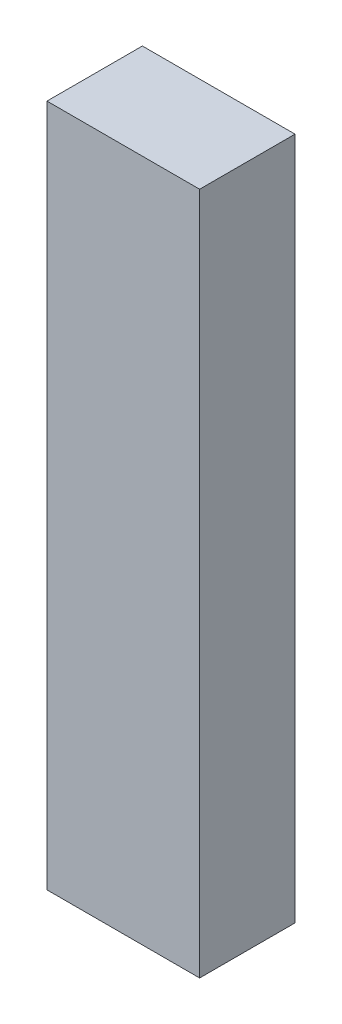
ISO-10303-21;
HEADER;
FILE_DESCRIPTION(('STEP AP214'),'2;1');
FILE_NAME('part.step','',(''),(''),'','','');
FILE_SCHEMA(('AUTOMOTIVE_DESIGN { 1 0 10303 214 1 1 1 1 }'));
ENDSEC;
DATA;
#1=APPLICATION_CONTEXT('core data for automotive mechanical design processes');
#2=APPLICATION_PROTOCOL_DEFINITION('international standard','automotive_design',2000,#1);
#3=PRODUCT_CONTEXT('',#1,'mechanical');
#4=PRODUCT('Part','Part','',(#3));
#5=PRODUCT_RELATED_PRODUCT_CATEGORY('part','',(#4));
#6=PRODUCT_DEFINITION_FORMATION('','',#4);
#7=PRODUCT_DEFINITION_CONTEXT('part definition',#1,'design');
#8=PRODUCT_DEFINITION('design','',#6,#7);
#9=PRODUCT_DEFINITION_SHAPE('','',#8);
#10=(LENGTH_UNIT() NAMED_UNIT(*) SI_UNIT(.MILLI.,.METRE.));
#11=(NAMED_UNIT(*) PLANE_ANGLE_UNIT() SI_UNIT($,.RADIAN.));
#12=(NAMED_UNIT(*) SI_UNIT($,.STERADIAN.) SOLID_ANGLE_UNIT());
#13=UNCERTAINTY_MEASURE_WITH_UNIT(LENGTH_MEASURE(1.E-05),#10,'distance_accuracy_value','');
#14=(GEOMETRIC_REPRESENTATION_CONTEXT(3) GLOBAL_UNCERTAINTY_ASSIGNED_CONTEXT((#13)) GLOBAL_UNIT_ASSIGNED_CONTEXT((#10,
#11,#12)) REPRESENTATION_CONTEXT('',''));
#15=CARTESIAN_POINT('',(0.,0.,0.));
#16=DIRECTION('',(0.,0.,1.));
#17=DIRECTION('',(1.,0.,0.));
#18=AXIS2_PLACEMENT_3D('',#15,#16,#17);
#19=CARTESIAN_POINT('',(1298.,1469.,-800.));
#20=DIRECTION('',(-1.,0.,0.));
#21=DIRECTION('',(0.,0.,1.));
#22=AXIS2_PLACEMENT_3D('',#19,#20,#21);
#23=PLANE('',#22);
#24=DIRECTION('',(0.,-1.,0.));
#25=VECTOR('',#24,1.);
#26=CARTESIAN_POINT('',(1298.,1469.,-775.));
#27=LINE('',#26,#25);
#28=CARTESIAN_POINT('',(1298.,1648.,-775.));
#29=VERTEX_POINT('',#28);
#30=CARTESIAN_POINT('',(1298.,1469.,-775.));
#31=VERTEX_POINT('',#30);
#32=EDGE_CURVE('E103',#29,#31,#27,.T.);
#33=ORIENTED_EDGE('',*,*,#32,.F.);
#34=DIRECTION('',(0.,0.,1.));
#35=VECTOR('',#34,1.);
#36=CARTESIAN_POINT('',(1298.,1648.,-800.));
#37=LINE('',#36,#35);
#38=CARTESIAN_POINT('',(1298.,1648.,-800.));
#39=VERTEX_POINT('',#38);
#40=EDGE_CURVE('E11',#39,#29,#37,.T.);
#41=ORIENTED_EDGE('',*,*,#40,.F.);
#42=DIRECTION('',(0.,-1.,0.));
#43=VECTOR('',#42,1.);
#44=CARTESIAN_POINT('',(1298.,1469.,-800.));
#45=LINE('',#44,#43);
#46=CARTESIAN_POINT('',(1298.,1469.,-800.));
#47=VERTEX_POINT('',#46);
#48=EDGE_CURVE('E97',#39,#47,#45,.T.);
#49=ORIENTED_EDGE('',*,*,#48,.T.);
#50=DIRECTION('',(0.,0.,1.));
#51=VECTOR('',#50,1.);
#52=CARTESIAN_POINT('',(1298.,1469.,-800.));
#53=LINE('',#52,#51);
#54=EDGE_CURVE('E42',#47,#31,#53,.T.);
#55=ORIENTED_EDGE('',*,*,#54,.T.);
#56=EDGE_LOOP('',(#33,#41,#49,#55));
#57=FACE_BOUND('',#56,.T.);
#58=ADVANCED_FACE('F39',(#57),#23,.T.);
#59=CARTESIAN_POINT('',(1298.,1648.,-800.));
#60=DIRECTION('',(0.,1.,0.));
#61=DIRECTION('',(0.,0.,1.));
#62=AXIS2_PLACEMENT_3D('',#59,#60,#61);
#63=PLANE('',#62);
#64=DIRECTION('',(-1.,0.,0.));
#65=VECTOR('',#64,1.);
#66=CARTESIAN_POINT('',(1298.,1648.,-775.));
#67=LINE('',#66,#65);
#68=CARTESIAN_POINT('',(1338.,1648.,-775.));
#69=VERTEX_POINT('',#68);
#70=EDGE_CURVE('E99',#69,#29,#67,.T.);
#71=ORIENTED_EDGE('',*,*,#70,.F.);
#72=DIRECTION('',(0.,0.,1.));
#73=VECTOR('',#72,1.);
#74=CARTESIAN_POINT('',(1338.,1648.,-800.));
#75=LINE('',#74,#73);
#76=CARTESIAN_POINT('',(1338.,1648.,-800.));
#77=VERTEX_POINT('',#76);
#78=EDGE_CURVE('E48',#77,#69,#75,.T.);
#79=ORIENTED_EDGE('',*,*,#78,.F.);
#80=DIRECTION('',(-1.,0.,0.));
#81=VECTOR('',#80,1.);
#82=CARTESIAN_POINT('',(1298.,1648.,-800.));
#83=LINE('',#82,#81);
#84=EDGE_CURVE('E94',#77,#39,#83,.T.);
#85=ORIENTED_EDGE('',*,*,#84,.T.);
#86=ORIENTED_EDGE('',*,*,#40,.T.);
#87=EDGE_LOOP('',(#71,#79,#85,#86));
#88=FACE_BOUND('',#87,.T.);
#89=ADVANCED_FACE('F113',(#88),#63,.T.);
#90=CARTESIAN_POINT('',(1338.,1469.,-800.));
#91=DIRECTION('',(1.,0.,0.));
#92=DIRECTION('',(0.,0.,-1.));
#93=AXIS2_PLACEMENT_3D('',#90,#91,#92);
#94=PLANE('',#93);
#95=DIRECTION('',(0.,1.,0.));
#96=VECTOR('',#95,1.);
#97=CARTESIAN_POINT('',(1338.,1469.,-775.));
#98=LINE('',#97,#96);
#99=CARTESIAN_POINT('',(1338.,1469.,-775.));
#100=VERTEX_POINT('',#99);
#101=EDGE_CURVE('E89',#100,#69,#98,.T.);
#102=ORIENTED_EDGE('',*,*,#101,.F.);
#103=DIRECTION('',(0.,0.,1.));
#104=VECTOR('',#103,1.);
#105=CARTESIAN_POINT('',(1338.,1469.,-800.));
#106=LINE('',#105,#104);
#107=CARTESIAN_POINT('',(1338.,1469.,-800.));
#108=VERTEX_POINT('',#107);
#109=EDGE_CURVE('E84',#108,#100,#106,.T.);
#110=ORIENTED_EDGE('',*,*,#109,.F.);
#111=DIRECTION('',(0.,1.,0.));
#112=VECTOR('',#111,1.);
#113=CARTESIAN_POINT('',(1338.,1469.,-800.));
#114=LINE('',#113,#112);
#115=EDGE_CURVE('E87',#108,#77,#114,.T.);
#116=ORIENTED_EDGE('',*,*,#115,.T.);
#117=ORIENTED_EDGE('',*,*,#78,.T.);
#118=EDGE_LOOP('',(#102,#110,#116,#117));
#119=FACE_BOUND('',#118,.T.);
#120=ADVANCED_FACE('F86',(#119),#94,.T.);
#121=CARTESIAN_POINT('',(1298.,1469.,-800.));
#122=DIRECTION('',(0.,-1.,0.));
#123=DIRECTION('',(0.,0.,-1.));
#124=AXIS2_PLACEMENT_3D('',#121,#122,#123);
#125=PLANE('',#124);
#126=DIRECTION('',(1.,0.,0.));
#127=VECTOR('',#126,1.);
#128=CARTESIAN_POINT('',(1298.,1469.,-775.));
#129=LINE('',#128,#127);
#130=EDGE_CURVE('E106',#31,#100,#129,.T.);
#131=ORIENTED_EDGE('',*,*,#130,.F.);
#132=ORIENTED_EDGE('',*,*,#54,.F.);
#133=DIRECTION('',(1.,0.,0.));
#134=VECTOR('',#133,1.);
#135=CARTESIAN_POINT('',(1298.,1469.,-800.));
#136=LINE('',#135,#134);
#137=EDGE_CURVE('E93',#47,#108,#136,.T.);
#138=ORIENTED_EDGE('',*,*,#137,.T.);
#139=ORIENTED_EDGE('',*,*,#109,.T.);
#140=EDGE_LOOP('',(#131,#132,#138,#139));
#141=FACE_BOUND('',#140,.T.);
#142=ADVANCED_FACE('F96',(#141),#125,.T.);
#143=CARTESIAN_POINT('',(0.,0.,-800.));
#144=DIRECTION('',(0.,0.,-1.));
#145=DIRECTION('',(-1.,0.,0.));
#146=AXIS2_PLACEMENT_3D('',#143,#144,#145);
#147=PLANE('',#146);
#148=ORIENTED_EDGE('',*,*,#48,.F.);
#149=ORIENTED_EDGE('',*,*,#84,.F.);
#150=ORIENTED_EDGE('',*,*,#115,.F.);
#151=ORIENTED_EDGE('',*,*,#137,.F.);
#152=EDGE_LOOP('',(#148,#149,#150,#151));
#153=FACE_BOUND('',#152,.T.);
#154=ADVANCED_FACE('F92',(#153),#147,.T.);
#155=CARTESIAN_POINT('',(0.,0.,-775.));
#156=DIRECTION('',(0.,0.,-1.));
#157=DIRECTION('',(-1.,0.,0.));
#158=AXIS2_PLACEMENT_3D('',#155,#156,#157);
#159=PLANE('',#158);
#160=ORIENTED_EDGE('',*,*,#32,.T.);
#161=ORIENTED_EDGE('',*,*,#130,.T.);
#162=ORIENTED_EDGE('',*,*,#101,.T.);
#163=ORIENTED_EDGE('',*,*,#70,.T.);
#164=EDGE_LOOP('',(#160,#161,#162,#163));
#165=FACE_BOUND('',#164,.T.);
#166=ADVANCED_FACE('F112',(#165),#159,.F.);
#167=CLOSED_SHELL('',(#58,#89,#120,#142,#154,#166));
#168=MANIFOLD_SOLID_BREP('B2',#167);
#169=ADVANCED_BREP_SHAPE_REPRESENTATION('',(#18,#168),#14);
#170=SHAPE_DEFINITION_REPRESENTATION(#9,#169);
ENDSEC;
END-ISO-10303-21;
